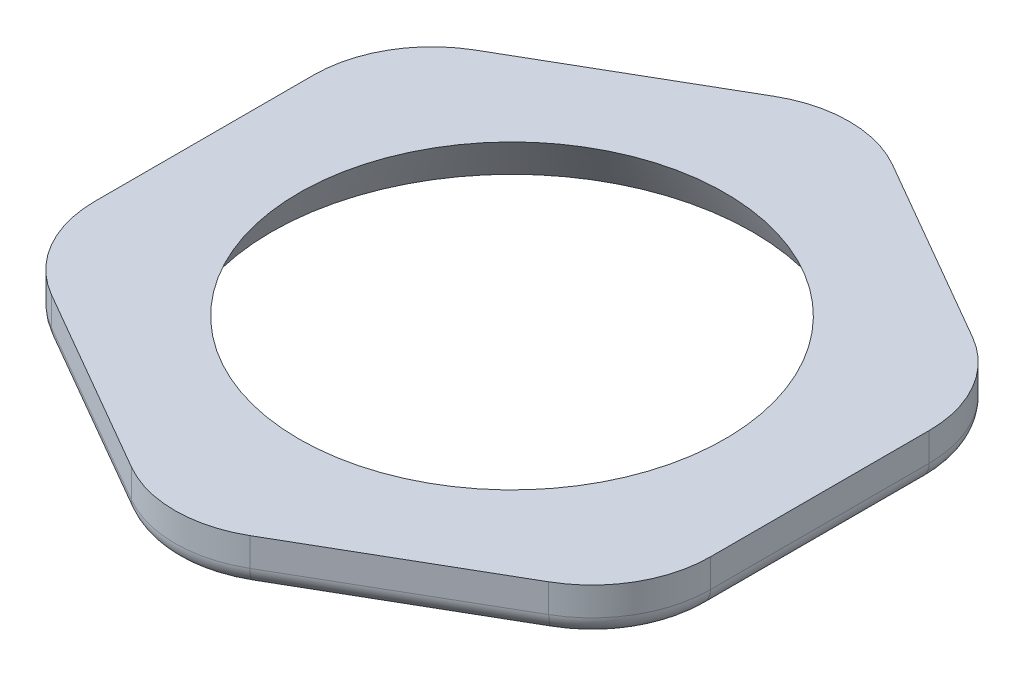
ISO-10303-21;
HEADER;
FILE_DESCRIPTION(('STEP AP214'),'2;1');
FILE_NAME('part.step','',(''),(''),'','','');
FILE_SCHEMA(('AUTOMOTIVE_DESIGN { 1 0 10303 214 1 1 1 1 }'));
ENDSEC;
DATA;
#1=APPLICATION_CONTEXT('core data for automotive mechanical design processes');
#2=APPLICATION_PROTOCOL_DEFINITION('international standard','automotive_design',2000,#1);
#3=PRODUCT_CONTEXT('',#1,'mechanical');
#4=PRODUCT('Part','Part','',(#3));
#5=PRODUCT_RELATED_PRODUCT_CATEGORY('part','',(#4));
#6=PRODUCT_DEFINITION_FORMATION('','',#4);
#7=PRODUCT_DEFINITION_CONTEXT('part definition',#1,'design');
#8=PRODUCT_DEFINITION('design','',#6,#7);
#9=PRODUCT_DEFINITION_SHAPE('','',#8);
#10=(LENGTH_UNIT() NAMED_UNIT(*) SI_UNIT(.MILLI.,.METRE.));
#11=(NAMED_UNIT(*) PLANE_ANGLE_UNIT() SI_UNIT($,.RADIAN.));
#12=(NAMED_UNIT(*) SI_UNIT($,.STERADIAN.) SOLID_ANGLE_UNIT());
#13=UNCERTAINTY_MEASURE_WITH_UNIT(LENGTH_MEASURE(1.E-05),#10,'distance_accuracy_value','');
#14=(GEOMETRIC_REPRESENTATION_CONTEXT(3) GLOBAL_UNCERTAINTY_ASSIGNED_CONTEXT((#13)) GLOBAL_UNIT_ASSIGNED_CONTEXT((#10,
#11,#12)) REPRESENTATION_CONTEXT('',''));
#15=CARTESIAN_POINT('',(0.,0.,0.));
#16=DIRECTION('',(0.,0.,1.));
#17=DIRECTION('',(1.,0.,0.));
#18=AXIS2_PLACEMENT_3D('',#15,#16,#17);
#19=CARTESIAN_POINT('',(4.,1.,-2.3094010767585));
#20=DIRECTION('',(0.,1.,0.));
#21=DIRECTION('',(0.,0.,1.));
#22=AXIS2_PLACEMENT_3D('',#19,#20,#21);
#23=PLANE('',#22);
#24=CARTESIAN_POINT('',(4.,1.,-2.3094010767585));
#25=DIRECTION('',(0.,1.,0.));
#26=DIRECTION('',(0.,0.,1.));
#27=AXIS2_PLACEMENT_3D('',#24,#25,#26);
#28=CIRCLE('',#27,2.5);
#29=CARTESIAN_POINT('',(6.5,1.,-2.3094010767585));
#30=VERTEX_POINT('',#29);
#31=CARTESIAN_POINT('',(5.25,1.,-4.4744645862196));
#32=VERTEX_POINT('',#31);
#33=EDGE_CURVE('E183',#30,#32,#28,.T.);
#34=ORIENTED_EDGE('',*,*,#33,.T.);
#35=DIRECTION('',(-0.866025403784439,0.,-0.5));
#36=VECTOR('',#35,1.);
#37=CARTESIAN_POINT('',(5.25,1.,-4.4744645862196));
#38=LINE('',#37,#36);
#39=CARTESIAN_POINT('',(1.25,1.,-6.7838656629781));
#40=VERTEX_POINT('',#39);
#41=EDGE_CURVE('E172',#32,#40,#38,.T.);
#42=ORIENTED_EDGE('',*,*,#41,.T.);
#43=CARTESIAN_POINT('',(0.,1.,-4.61880215351701));
#44=DIRECTION('',(0.,1.,0.));
#45=DIRECTION('',(0.,0.,1.));
#46=AXIS2_PLACEMENT_3D('',#43,#44,#45);
#47=CIRCLE('',#46,2.5);
#48=CARTESIAN_POINT('',(-1.25,1.,-6.7838656629781));
#49=VERTEX_POINT('',#48);
#50=EDGE_CURVE('E182',#40,#49,#47,.T.);
#51=ORIENTED_EDGE('',*,*,#50,.T.);
#52=DIRECTION('',(-0.866025403784438,0.,0.5));
#53=VECTOR('',#52,1.);
#54=CARTESIAN_POINT('',(-1.25,1.,-6.7838656629781));
#55=LINE('',#54,#53);
#56=CARTESIAN_POINT('',(-5.25,1.,-4.4744645862196));
#57=VERTEX_POINT('',#56);
#58=EDGE_CURVE('E332',#49,#57,#55,.T.);
#59=ORIENTED_EDGE('',*,*,#58,.T.);
#60=CARTESIAN_POINT('',(-4.,1.,-2.3094010767585));
#61=DIRECTION('',(0.,1.,0.));
#62=DIRECTION('',(0.,0.,1.));
#63=AXIS2_PLACEMENT_3D('',#60,#61,#62);
#64=CIRCLE('',#63,2.5);
#65=CARTESIAN_POINT('',(-6.5,1.,-2.3094010767585));
#66=VERTEX_POINT('',#65);
#67=EDGE_CURVE('E335',#57,#66,#64,.T.);
#68=ORIENTED_EDGE('',*,*,#67,.T.);
#69=DIRECTION('',(0.,0.,1.));
#70=VECTOR('',#69,1.);
#71=CARTESIAN_POINT('',(-6.5,1.,-2.3094010767585));
#72=LINE('',#71,#70);
#73=CARTESIAN_POINT('',(-6.5,1.,2.3094010767585));
#74=VERTEX_POINT('',#73);
#75=EDGE_CURVE('E338',#66,#74,#72,.T.);
#76=ORIENTED_EDGE('',*,*,#75,.T.);
#77=CARTESIAN_POINT('',(-4.,1.,2.3094010767585));
#78=DIRECTION('',(0.,1.,0.));
#79=DIRECTION('',(0.,0.,1.));
#80=AXIS2_PLACEMENT_3D('',#77,#78,#79);
#81=CIRCLE('',#80,2.5);
#82=CARTESIAN_POINT('',(-5.25,1.,4.4744645862196));
#83=VERTEX_POINT('',#82);
#84=EDGE_CURVE('E341',#74,#83,#81,.T.);
#85=ORIENTED_EDGE('',*,*,#84,.T.);
#86=DIRECTION('',(0.866025403784439,0.,0.5));
#87=VECTOR('',#86,1.);
#88=CARTESIAN_POINT('',(-5.25,1.,4.4744645862196));
#89=LINE('',#88,#87);
#90=CARTESIAN_POINT('',(-1.25,1.,6.7838656629781));
#91=VERTEX_POINT('',#90);
#92=EDGE_CURVE('E344',#83,#91,#89,.T.);
#93=ORIENTED_EDGE('',*,*,#92,.T.);
#94=CARTESIAN_POINT('',(0.,1.,4.618802153517));
#95=DIRECTION('',(0.,1.,0.));
#96=DIRECTION('',(0.,0.,-1.));
#97=AXIS2_PLACEMENT_3D('',#94,#95,#96);
#98=CIRCLE('',#97,2.5);
#99=CARTESIAN_POINT('',(1.25,1.,6.7838656629781));
#100=VERTEX_POINT('',#99);
#101=EDGE_CURVE('E347',#91,#100,#98,.T.);
#102=ORIENTED_EDGE('',*,*,#101,.T.);
#103=DIRECTION('',(0.866025403784438,0.,-0.5));
#104=VECTOR('',#103,1.);
#105=CARTESIAN_POINT('',(1.25,1.,6.7838656629781));
#106=LINE('',#105,#104);
#107=CARTESIAN_POINT('',(5.25,1.,4.47446458621959));
#108=VERTEX_POINT('',#107);
#109=EDGE_CURVE('E350',#100,#108,#106,.T.);
#110=ORIENTED_EDGE('',*,*,#109,.T.);
#111=CARTESIAN_POINT('',(4.,1.,2.3094010767585));
#112=DIRECTION('',(0.,1.,0.));
#113=DIRECTION('',(0.,0.,-1.));
#114=AXIS2_PLACEMENT_3D('',#111,#112,#113);
#115=CIRCLE('',#114,2.5);
#116=CARTESIAN_POINT('',(6.5,1.,2.3094010767585));
#117=VERTEX_POINT('',#116);
#118=EDGE_CURVE('E353',#108,#117,#115,.T.);
#119=ORIENTED_EDGE('',*,*,#118,.T.);
#120=DIRECTION('',(0.,0.,-1.));
#121=VECTOR('',#120,1.);
#122=CARTESIAN_POINT('',(6.5,1.,2.3094010767585));
#123=LINE('',#122,#121);
#124=EDGE_CURVE('E188',#117,#30,#123,.T.);
#125=ORIENTED_EDGE('',*,*,#124,.T.);
#126=EDGE_LOOP('',(#34,#42,#51,#59,#68,#76,#85,#93,#102,#110,#119,#125));
#127=FACE_BOUND('',#126,.T.);
#128=CARTESIAN_POINT('',(0.,1.,0.));
#129=DIRECTION('',(0.,1.,0.));
#130=DIRECTION('',(0.,0.,1.));
#131=AXIS2_PLACEMENT_3D('',#128,#129,#130);
#132=CIRCLE('',#131,4.5);
#133=CARTESIAN_POINT('',(0.,1.,4.5));
#134=VERTEX_POINT('',#133);
#135=EDGE_CURVE('E316',#134,#134,#132,.T.);
#136=ORIENTED_EDGE('',*,*,#135,.F.);
#137=EDGE_LOOP('',(#136));
#138=FACE_BOUND('',#137,.T.);
#139=ADVANCED_FACE('F45',(#127,#138),#23,.T.);
#140=CARTESIAN_POINT('',(4.,0.,-2.3094010767585));
#141=DIRECTION('',(0.,1.,0.));
#142=DIRECTION('',(0.,0.,1.));
#143=AXIS2_PLACEMENT_3D('',#140,#141,#142);
#144=PLANE('',#143);
#145=DIRECTION('',(0.,0.,-1.));
#146=VECTOR('',#145,1.);
#147=CARTESIAN_POINT('',(6.1,0.,-2.3094010767585));
#148=LINE('',#147,#146);
#149=CARTESIAN_POINT('',(6.1,0.,-2.3094010767585));
#150=VERTEX_POINT('',#149);
#151=CARTESIAN_POINT('',(6.1,0.,2.3094010767585));
#152=VERTEX_POINT('',#151);
#153=EDGE_CURVE('E199',#150,#152,#148,.F.);
#154=ORIENTED_EDGE('',*,*,#153,.T.);
#155=CARTESIAN_POINT('',(4.,0.,2.3094010767585));
#156=DIRECTION('',(0.,1.,0.));
#157=DIRECTION('',(0.,0.,1.));
#158=AXIS2_PLACEMENT_3D('',#155,#156,#157);
#159=CIRCLE('',#158,2.1);
#160=CARTESIAN_POINT('',(5.05,0.,4.12805442470582));
#161=VERTEX_POINT('',#160);
#162=EDGE_CURVE('E237',#152,#161,#159,.F.);
#163=ORIENTED_EDGE('',*,*,#162,.T.);
#164=DIRECTION('',(0.866025403784439,0.,-0.5));
#165=VECTOR('',#164,1.);
#166=CARTESIAN_POINT('',(7.05,0.,2.97335388632657));
#167=LINE('',#166,#165);
#168=CARTESIAN_POINT('',(1.05,0.,6.43745550146432));
#169=VERTEX_POINT('',#168);
#170=EDGE_CURVE('E234',#161,#169,#167,.F.);
#171=ORIENTED_EDGE('',*,*,#170,.T.);
#172=CARTESIAN_POINT('',(0.,0.,4.618802153517));
#173=DIRECTION('',(0.,1.,0.));
#174=DIRECTION('',(0.,0.,1.));
#175=AXIS2_PLACEMENT_3D('',#172,#173,#174);
#176=CIRCLE('',#175,2.1);
#177=CARTESIAN_POINT('',(-1.05,0.,6.43745550146432));
#178=VERTEX_POINT('',#177);
#179=EDGE_CURVE('E231',#169,#178,#176,.F.);
#180=ORIENTED_EDGE('',*,*,#179,.T.);
#181=DIRECTION('',(0.866025403784439,0.,0.5));
#182=VECTOR('',#181,1.);
#183=CARTESIAN_POINT('',(-1.05,0.,6.43745550146433));
#184=LINE('',#183,#182);
#185=CARTESIAN_POINT('',(-5.05,0.,4.12805442470582));
#186=VERTEX_POINT('',#185);
#187=EDGE_CURVE('E228',#178,#186,#184,.F.);
#188=ORIENTED_EDGE('',*,*,#187,.T.);
#189=CARTESIAN_POINT('',(-4.,0.,2.3094010767585));
#190=DIRECTION('',(0.,1.,0.));
#191=DIRECTION('',(0.,0.,1.));
#192=AXIS2_PLACEMENT_3D('',#189,#190,#191);
#193=CIRCLE('',#192,2.1);
#194=CARTESIAN_POINT('',(-6.1,0.,2.3094010767585));
#195=VERTEX_POINT('',#194);
#196=EDGE_CURVE('E225',#186,#195,#193,.F.);
#197=ORIENTED_EDGE('',*,*,#196,.T.);
#198=DIRECTION('',(0.,0.,1.));
#199=VECTOR('',#198,1.);
#200=CARTESIAN_POINT('',(-6.1,0.,-2.3094010767585));
#201=LINE('',#200,#199);
#202=CARTESIAN_POINT('',(-6.1,0.,-2.3094010767585));
#203=VERTEX_POINT('',#202);
#204=EDGE_CURVE('E222',#195,#203,#201,.F.);
#205=ORIENTED_EDGE('',*,*,#204,.T.);
#206=CARTESIAN_POINT('',(-4.,0.,-2.3094010767585));
#207=DIRECTION('',(0.,1.,0.));
#208=DIRECTION('',(0.,0.,1.));
#209=AXIS2_PLACEMENT_3D('',#206,#207,#208);
#210=CIRCLE('',#209,2.1);
#211=CARTESIAN_POINT('',(-5.05,0.,-4.12805442470582));
#212=VERTEX_POINT('',#211);
#213=EDGE_CURVE('E219',#203,#212,#210,.F.);
#214=ORIENTED_EDGE('',*,*,#213,.T.);
#215=DIRECTION('',(-0.866025403784438,0.,0.5));
#216=VECTOR('',#215,1.);
#217=CARTESIAN_POINT('',(0.949999999999999,0.,-7.59215603984358));
#218=LINE('',#217,#216);
#219=CARTESIAN_POINT('',(-1.05,0.,-6.43745550146433));
#220=VERTEX_POINT('',#219);
#221=EDGE_CURVE('E216',#212,#220,#218,.F.);
#222=ORIENTED_EDGE('',*,*,#221,.T.);
#223=CARTESIAN_POINT('',(0.,0.,-4.61880215351701));
#224=DIRECTION('',(0.,1.,0.));
#225=DIRECTION('',(0.,0.,1.));
#226=AXIS2_PLACEMENT_3D('',#223,#224,#225);
#227=CIRCLE('',#226,2.1);
#228=CARTESIAN_POINT('',(1.05,0.,-6.43745550146433));
#229=VERTEX_POINT('',#228);
#230=EDGE_CURVE('E213',#220,#229,#227,.F.);
#231=ORIENTED_EDGE('',*,*,#230,.T.);
#232=DIRECTION('',(-0.866025403784439,0.,-0.5));
#233=VECTOR('',#232,1.);
#234=CARTESIAN_POINT('',(5.05,0.,-4.12805442470582));
#235=LINE('',#234,#233);
#236=CARTESIAN_POINT('',(5.05,0.,-4.12805442470582));
#237=VERTEX_POINT('',#236);
#238=EDGE_CURVE('E210',#229,#237,#235,.F.);
#239=ORIENTED_EDGE('',*,*,#238,.T.);
#240=CARTESIAN_POINT('',(4.,0.,-2.3094010767585));
#241=DIRECTION('',(0.,1.,0.));
#242=DIRECTION('',(0.,0.,1.));
#243=AXIS2_PLACEMENT_3D('',#240,#241,#242);
#244=CIRCLE('',#243,2.1);
#245=EDGE_CURVE('E207',#237,#150,#244,.F.);
#246=ORIENTED_EDGE('',*,*,#245,.T.);
#247=EDGE_LOOP('',(#154,#163,#171,#180,#188,#197,#205,#214,#222,#231,#239,#246));
#248=FACE_BOUND('',#247,.T.);
#249=CARTESIAN_POINT('',(0.,0.,0.));
#250=DIRECTION('',(0.,1.,0.));
#251=DIRECTION('',(0.,0.,1.));
#252=AXIS2_PLACEMENT_3D('',#249,#250,#251);
#253=CIRCLE('',#252,5.07735026918963);
#254=CARTESIAN_POINT('',(0.,0.,5.07735026918963));
#255=VERTEX_POINT('',#254);
#256=EDGE_CURVE('E190',#255,#255,#253,.T.);
#257=ORIENTED_EDGE('',*,*,#256,.T.);
#258=EDGE_LOOP('',(#257));
#259=FACE_BOUND('',#258,.T.);
#260=ADVANCED_FACE('F408',(#248,#259),#144,.F.);
#261=CARTESIAN_POINT('',(4.,1.,-2.3094010767585));
#262=DIRECTION('',(0.,-1.,0.));
#263=DIRECTION('',(0.,0.,-1.));
#264=AXIS2_PLACEMENT_3D('',#261,#262,#263);
#265=CYLINDRICAL_SURFACE('',#264,2.5);
#266=DIRECTION('',(0.,-1.,0.));
#267=VECTOR('',#266,1.);
#268=CARTESIAN_POINT('',(6.5,1.,-2.3094010767585));
#269=LINE('',#268,#267);
#270=CARTESIAN_POINT('',(6.5,0.4,-2.3094010767585));
#271=VERTEX_POINT('',#270);
#272=EDGE_CURVE('E358',#30,#271,#269,.T.);
#273=ORIENTED_EDGE('',*,*,#272,.T.);
#274=CARTESIAN_POINT('',(4.,0.4,-2.3094010767585));
#275=DIRECTION('',(0.,1.,0.));
#276=DIRECTION('',(0.,0.,1.));
#277=AXIS2_PLACEMENT_3D('',#274,#275,#276);
#278=CIRCLE('',#277,2.5);
#279=CARTESIAN_POINT('',(5.25,0.4,-4.4744645862196));
#280=VERTEX_POINT('',#279);
#281=EDGE_CURVE('E55',#271,#280,#278,.T.);
#282=ORIENTED_EDGE('',*,*,#281,.T.);
#283=DIRECTION('',(0.,-1.,0.));
#284=VECTOR('',#283,1.);
#285=CARTESIAN_POINT('',(5.25,1.,-4.4744645862196));
#286=LINE('',#285,#284);
#287=EDGE_CURVE('E175',#32,#280,#286,.T.);
#288=ORIENTED_EDGE('',*,*,#287,.F.);
#289=ORIENTED_EDGE('',*,*,#33,.F.);
#290=EDGE_LOOP('',(#273,#282,#288,#289));
#291=FACE_BOUND('',#290,.T.);
#292=ADVANCED_FACE('F192',(#291),#265,.T.);
#293=CARTESIAN_POINT('',(5.25,1.,-4.4744645862196));
#294=DIRECTION('',(-0.5,0.,0.866025403784439));
#295=DIRECTION('',(0.866025403784439,0.,0.5));
#296=AXIS2_PLACEMENT_3D('',#293,#294,#295);
#297=PLANE('',#296);
#298=ORIENTED_EDGE('',*,*,#287,.T.);
#299=DIRECTION('',(-0.866025403784439,0.,-0.5));
#300=VECTOR('',#299,1.);
#301=CARTESIAN_POINT('',(5.25,0.4,-4.4744645862196));
#302=LINE('',#301,#300);
#303=CARTESIAN_POINT('',(1.25,0.4,-6.7838656629781));
#304=VERTEX_POINT('',#303);
#305=EDGE_CURVE('E265',#280,#304,#302,.T.);
#306=ORIENTED_EDGE('',*,*,#305,.T.);
#307=DIRECTION('',(0.,-1.,0.));
#308=VECTOR('',#307,1.);
#309=CARTESIAN_POINT('',(1.25,1.,-6.7838656629781));
#310=LINE('',#309,#308);
#311=EDGE_CURVE('E178',#40,#304,#310,.T.);
#312=ORIENTED_EDGE('',*,*,#311,.F.);
#313=ORIENTED_EDGE('',*,*,#41,.F.);
#314=EDGE_LOOP('',(#298,#306,#312,#313));
#315=FACE_BOUND('',#314,.T.);
#316=ADVANCED_FACE('F174',(#315),#297,.F.);
#317=CARTESIAN_POINT('',(0.,1.,-4.61880215351701));
#318=DIRECTION('',(0.,-1.,0.));
#319=DIRECTION('',(0.,0.,-1.));
#320=AXIS2_PLACEMENT_3D('',#317,#318,#319);
#321=CYLINDRICAL_SURFACE('',#320,2.5);
#322=ORIENTED_EDGE('',*,*,#311,.T.);
#323=CARTESIAN_POINT('',(0.,0.4,-4.61880215351701));
#324=DIRECTION('',(0.,1.,0.));
#325=DIRECTION('',(0.,0.,1.));
#326=AXIS2_PLACEMENT_3D('',#323,#324,#325);
#327=CIRCLE('',#326,2.5);
#328=CARTESIAN_POINT('',(-1.25,0.4,-6.7838656629781));
#329=VERTEX_POINT('',#328);
#330=EDGE_CURVE('E262',#304,#329,#327,.T.);
#331=ORIENTED_EDGE('',*,*,#330,.T.);
#332=DIRECTION('',(0.,-1.,0.));
#333=VECTOR('',#332,1.);
#334=CARTESIAN_POINT('',(-1.25,1.,-6.7838656629781));
#335=LINE('',#334,#333);
#336=EDGE_CURVE('E201',#49,#329,#335,.T.);
#337=ORIENTED_EDGE('',*,*,#336,.F.);
#338=ORIENTED_EDGE('',*,*,#50,.F.);
#339=EDGE_LOOP('',(#322,#331,#337,#338));
#340=FACE_BOUND('',#339,.T.);
#341=ADVANCED_FACE('F424',(#340),#321,.T.);
#342=CARTESIAN_POINT('',(-1.25,1.,-6.7838656629781));
#343=DIRECTION('',(0.5,0.,0.866025403784439));
#344=DIRECTION('',(0.866025403784438,0.,-0.5));
#345=AXIS2_PLACEMENT_3D('',#342,#343,#344);
#346=PLANE('',#345);
#347=ORIENTED_EDGE('',*,*,#336,.T.);
#348=DIRECTION('',(-0.866025403784438,0.,0.5));
#349=VECTOR('',#348,1.);
#350=CARTESIAN_POINT('',(-1.25,0.4,-6.7838656629781));
#351=LINE('',#350,#349);
#352=CARTESIAN_POINT('',(-5.25,0.4,-4.4744645862196));
#353=VERTEX_POINT('',#352);
#354=EDGE_CURVE('E259',#329,#353,#351,.T.);
#355=ORIENTED_EDGE('',*,*,#354,.T.);
#356=DIRECTION('',(0.,-1.,0.));
#357=VECTOR('',#356,1.);
#358=CARTESIAN_POINT('',(-5.25,1.,-4.4744645862196));
#359=LINE('',#358,#357);
#360=EDGE_CURVE('E388',#57,#353,#359,.T.);
#361=ORIENTED_EDGE('',*,*,#360,.F.);
#362=ORIENTED_EDGE('',*,*,#58,.F.);
#363=EDGE_LOOP('',(#347,#355,#361,#362));
#364=FACE_BOUND('',#363,.T.);
#365=ADVANCED_FACE('F396',(#364),#346,.F.);
#366=CARTESIAN_POINT('',(-4.,1.,-2.3094010767585));
#367=DIRECTION('',(0.,-1.,0.));
#368=DIRECTION('',(0.,0.,-1.));
#369=AXIS2_PLACEMENT_3D('',#366,#367,#368);
#370=CYLINDRICAL_SURFACE('',#369,2.5);
#371=ORIENTED_EDGE('',*,*,#360,.T.);
#372=CARTESIAN_POINT('',(-4.,0.4,-2.3094010767585));
#373=DIRECTION('',(0.,1.,0.));
#374=DIRECTION('',(0.,0.,1.));
#375=AXIS2_PLACEMENT_3D('',#372,#373,#374);
#376=CIRCLE('',#375,2.5);
#377=CARTESIAN_POINT('',(-6.5,0.4,-2.3094010767585));
#378=VERTEX_POINT('',#377);
#379=EDGE_CURVE('E256',#353,#378,#376,.T.);
#380=ORIENTED_EDGE('',*,*,#379,.T.);
#381=DIRECTION('',(0.,-1.,0.));
#382=VECTOR('',#381,1.);
#383=CARTESIAN_POINT('',(-6.5,1.,-2.3094010767585));
#384=LINE('',#383,#382);
#385=EDGE_CURVE('E384',#66,#378,#384,.T.);
#386=ORIENTED_EDGE('',*,*,#385,.F.);
#387=ORIENTED_EDGE('',*,*,#67,.F.);
#388=EDGE_LOOP('',(#371,#380,#386,#387));
#389=FACE_BOUND('',#388,.T.);
#390=ADVANCED_FACE('F416',(#389),#370,.T.);
#391=CARTESIAN_POINT('',(-6.5,1.,-2.3094010767585));
#392=DIRECTION('',(1.,0.,0.));
#393=DIRECTION('',(0.,0.,-1.));
#394=AXIS2_PLACEMENT_3D('',#391,#392,#393);
#395=PLANE('',#394);
#396=ORIENTED_EDGE('',*,*,#385,.T.);
#397=DIRECTION('',(0.,0.,1.));
#398=VECTOR('',#397,1.);
#399=CARTESIAN_POINT('',(-6.5,0.4,-2.3094010767585));
#400=LINE('',#399,#398);
#401=CARTESIAN_POINT('',(-6.5,0.4,2.3094010767585));
#402=VERTEX_POINT('',#401);
#403=EDGE_CURVE('E253',#378,#402,#400,.T.);
#404=ORIENTED_EDGE('',*,*,#403,.T.);
#405=DIRECTION('',(0.,-1.,0.));
#406=VECTOR('',#405,1.);
#407=CARTESIAN_POINT('',(-6.5,1.,2.3094010767585));
#408=LINE('',#407,#406);
#409=EDGE_CURVE('E380',#74,#402,#408,.T.);
#410=ORIENTED_EDGE('',*,*,#409,.F.);
#411=ORIENTED_EDGE('',*,*,#75,.F.);
#412=EDGE_LOOP('',(#396,#404,#410,#411));
#413=FACE_BOUND('',#412,.T.);
#414=ADVANCED_FACE('F420',(#413),#395,.F.);
#415=CARTESIAN_POINT('',(-4.,1.,2.3094010767585));
#416=DIRECTION('',(0.,-1.,0.));
#417=DIRECTION('',(0.,0.,-1.));
#418=AXIS2_PLACEMENT_3D('',#415,#416,#417);
#419=CYLINDRICAL_SURFACE('',#418,2.5);
#420=ORIENTED_EDGE('',*,*,#409,.T.);
#421=CARTESIAN_POINT('',(-4.,0.4,2.3094010767585));
#422=DIRECTION('',(0.,1.,0.));
#423=DIRECTION('',(0.,0.,1.));
#424=AXIS2_PLACEMENT_3D('',#421,#422,#423);
#425=CIRCLE('',#424,2.5);
#426=CARTESIAN_POINT('',(-5.25,0.4,4.4744645862196));
#427=VERTEX_POINT('',#426);
#428=EDGE_CURVE('E250',#402,#427,#425,.T.);
#429=ORIENTED_EDGE('',*,*,#428,.T.);
#430=DIRECTION('',(0.,-1.,0.));
#431=VECTOR('',#430,1.);
#432=CARTESIAN_POINT('',(-5.25,1.,4.4744645862196));
#433=LINE('',#432,#431);
#434=EDGE_CURVE('E376',#83,#427,#433,.T.);
#435=ORIENTED_EDGE('',*,*,#434,.F.);
#436=ORIENTED_EDGE('',*,*,#84,.F.);
#437=EDGE_LOOP('',(#420,#429,#435,#436));
#438=FACE_BOUND('',#437,.T.);
#439=ADVANCED_FACE('F461',(#438),#419,.T.);
#440=CARTESIAN_POINT('',(-5.25,1.,4.4744645862196));
#441=DIRECTION('',(0.5,0.,-0.866025403784439));
#442=DIRECTION('',(-0.866025403784439,0.,-0.5));
#443=AXIS2_PLACEMENT_3D('',#440,#441,#442);
#444=PLANE('',#443);
#445=ORIENTED_EDGE('',*,*,#434,.T.);
#446=DIRECTION('',(0.866025403784439,0.,0.5));
#447=VECTOR('',#446,1.);
#448=CARTESIAN_POINT('',(-5.25,0.4,4.4744645862196));
#449=LINE('',#448,#447);
#450=CARTESIAN_POINT('',(-1.25,0.4,6.7838656629781));
#451=VERTEX_POINT('',#450);
#452=EDGE_CURVE('E247',#427,#451,#449,.T.);
#453=ORIENTED_EDGE('',*,*,#452,.T.);
#454=DIRECTION('',(0.,-1.,0.));
#455=VECTOR('',#454,1.);
#456=CARTESIAN_POINT('',(-1.25,1.,6.7838656629781));
#457=LINE('',#456,#455);
#458=EDGE_CURVE('E372',#91,#451,#457,.T.);
#459=ORIENTED_EDGE('',*,*,#458,.F.);
#460=ORIENTED_EDGE('',*,*,#92,.F.);
#461=EDGE_LOOP('',(#445,#453,#459,#460));
#462=FACE_BOUND('',#461,.T.);
#463=ADVANCED_FACE('F457',(#462),#444,.F.);
#464=CARTESIAN_POINT('',(0.,1.,4.618802153517));
#465=DIRECTION('',(0.,-1.,0.));
#466=DIRECTION('',(0.,0.,-1.));
#467=AXIS2_PLACEMENT_3D('',#464,#465,#466);
#468=CYLINDRICAL_SURFACE('',#467,2.5);
#469=ORIENTED_EDGE('',*,*,#458,.T.);
#470=CARTESIAN_POINT('',(0.,0.4,4.618802153517));
#471=DIRECTION('',(0.,1.,0.));
#472=DIRECTION('',(0.,0.,1.));
#473=AXIS2_PLACEMENT_3D('',#470,#471,#472);
#474=CIRCLE('',#473,2.5);
#475=CARTESIAN_POINT('',(1.25,0.4,6.7838656629781));
#476=VERTEX_POINT('',#475);
#477=EDGE_CURVE('E244',#451,#476,#474,.T.);
#478=ORIENTED_EDGE('',*,*,#477,.T.);
#479=DIRECTION('',(0.,-1.,0.));
#480=VECTOR('',#479,1.);
#481=CARTESIAN_POINT('',(1.25,1.,6.7838656629781));
#482=LINE('',#481,#480);
#483=EDGE_CURVE('E368',#100,#476,#482,.T.);
#484=ORIENTED_EDGE('',*,*,#483,.F.);
#485=ORIENTED_EDGE('',*,*,#101,.F.);
#486=EDGE_LOOP('',(#469,#478,#484,#485));
#487=FACE_BOUND('',#486,.T.);
#488=ADVANCED_FACE('F453',(#487),#468,.T.);
#489=CARTESIAN_POINT('',(1.25,1.,6.7838656629781));
#490=DIRECTION('',(-0.5,0.,-0.866025403784438));
#491=DIRECTION('',(-0.866025403784439,0.,0.5));
#492=AXIS2_PLACEMENT_3D('',#489,#490,#491);
#493=PLANE('',#492);
#494=ORIENTED_EDGE('',*,*,#483,.T.);
#495=DIRECTION('',(0.866025403784439,0.,-0.5));
#496=VECTOR('',#495,1.);
#497=CARTESIAN_POINT('',(1.25,0.4,6.7838656629781));
#498=LINE('',#497,#496);
#499=CARTESIAN_POINT('',(5.25,0.4,4.47446458621959));
#500=VERTEX_POINT('',#499);
#501=EDGE_CURVE('E241',#476,#500,#498,.T.);
#502=ORIENTED_EDGE('',*,*,#501,.T.);
#503=DIRECTION('',(0.,-1.,0.));
#504=VECTOR('',#503,1.);
#505=CARTESIAN_POINT('',(5.25,1.,4.47446458621959));
#506=LINE('',#505,#504);
#507=EDGE_CURVE('E364',#108,#500,#506,.T.);
#508=ORIENTED_EDGE('',*,*,#507,.F.);
#509=ORIENTED_EDGE('',*,*,#109,.F.);
#510=EDGE_LOOP('',(#494,#502,#508,#509));
#511=FACE_BOUND('',#510,.T.);
#512=ADVANCED_FACE('F449',(#511),#493,.F.);
#513=CARTESIAN_POINT('',(4.,1.,2.3094010767585));
#514=DIRECTION('',(0.,-1.,0.));
#515=DIRECTION('',(0.,0.,-1.));
#516=AXIS2_PLACEMENT_3D('',#513,#514,#515);
#517=CYLINDRICAL_SURFACE('',#516,2.5);
#518=ORIENTED_EDGE('',*,*,#507,.T.);
#519=CARTESIAN_POINT('',(4.,0.4,2.3094010767585));
#520=DIRECTION('',(0.,1.,0.));
#521=DIRECTION('',(0.,0.,1.));
#522=AXIS2_PLACEMENT_3D('',#519,#520,#521);
#523=CIRCLE('',#522,2.5);
#524=CARTESIAN_POINT('',(6.5,0.4,2.3094010767585));
#525=VERTEX_POINT('',#524);
#526=EDGE_CURVE('E194',#500,#525,#523,.T.);
#527=ORIENTED_EDGE('',*,*,#526,.T.);
#528=DIRECTION('',(0.,-1.,0.));
#529=VECTOR('',#528,1.);
#530=CARTESIAN_POINT('',(6.5,1.,2.3094010767585));
#531=LINE('',#530,#529);
#532=EDGE_CURVE('E361',#117,#525,#531,.T.);
#533=ORIENTED_EDGE('',*,*,#532,.F.);
#534=ORIENTED_EDGE('',*,*,#118,.F.);
#535=EDGE_LOOP('',(#518,#527,#533,#534));
#536=FACE_BOUND('',#535,.T.);
#537=ADVANCED_FACE('F446',(#536),#517,.T.);
#538=CARTESIAN_POINT('',(6.5,1.,2.3094010767585));
#539=DIRECTION('',(-1.,0.,0.));
#540=DIRECTION('',(0.,0.,1.));
#541=AXIS2_PLACEMENT_3D('',#538,#539,#540);
#542=PLANE('',#541);
#543=ORIENTED_EDGE('',*,*,#532,.T.);
#544=DIRECTION('',(0.,0.,-1.));
#545=VECTOR('',#544,1.);
#546=CARTESIAN_POINT('',(6.5,0.4,2.3094010767585));
#547=LINE('',#546,#545);
#548=EDGE_CURVE('E11',#525,#271,#547,.T.);
#549=ORIENTED_EDGE('',*,*,#548,.T.);
#550=ORIENTED_EDGE('',*,*,#272,.F.);
#551=ORIENTED_EDGE('',*,*,#124,.F.);
#552=EDGE_LOOP('',(#543,#549,#550,#551));
#553=FACE_BOUND('',#552,.T.);
#554=ADVANCED_FACE('F443',(#553),#542,.F.);
#555=CARTESIAN_POINT('',(0.,1.,0.));
#556=DIRECTION('',(0.,-1.,0.));
#557=DIRECTION('',(0.,0.,1.));
#558=AXIS2_PLACEMENT_3D('',#555,#556,#557);
#559=CONICAL_SURFACE('',#558,4.5,0.5235987755983);
#560=ORIENTED_EDGE('',*,*,#256,.F.);
#561=EDGE_LOOP('',(#560));
#562=FACE_BOUND('',#561,.T.);
#563=ORIENTED_EDGE('',*,*,#135,.T.);
#564=EDGE_LOOP('',(#563));
#565=FACE_BOUND('',#564,.T.);
#566=ADVANCED_FACE('F441',(#562,#565),#559,.F.);
#567=CARTESIAN_POINT('',(-4.,0.4,-2.3094010767585));
#568=DIRECTION('',(0.,1.,0.));
#569=DIRECTION('',(0.,0.,1.));
#570=AXIS2_PLACEMENT_3D('',#567,#568,#569);
#571=TOROIDAL_SURFACE('',#570,2.1,0.4);
#572=CARTESIAN_POINT('',(-5.05,0.4,-4.12805442470582));
#573=DIRECTION('',(0.866025403784439,0.,-0.499999999999999));
#574=DIRECTION('',(-0.499999999999999,0.,-0.866025403784439));
#575=AXIS2_PLACEMENT_3D('',#572,#573,#574);
#576=CIRCLE('',#575,0.4);
#577=EDGE_CURVE('E307',#212,#353,#576,.T.);
#578=ORIENTED_EDGE('',*,*,#577,.F.);
#579=ORIENTED_EDGE('',*,*,#213,.F.);
#580=CARTESIAN_POINT('',(-6.1,0.4,-2.3094010767585));
#581=DIRECTION('',(0.,0.,1.));
#582=DIRECTION('',(1.,0.,0.));
#583=AXIS2_PLACEMENT_3D('',#580,#581,#582);
#584=CIRCLE('',#583,0.4);
#585=EDGE_CURVE('E49',#378,#203,#584,.T.);
#586=ORIENTED_EDGE('',*,*,#585,.F.);
#587=ORIENTED_EDGE('',*,*,#379,.F.);
#588=EDGE_LOOP('',(#578,#579,#586,#587));
#589=FACE_BOUND('',#588,.T.);
#590=ADVANCED_FACE('F47',(#589),#571,.T.);
#591=CARTESIAN_POINT('',(-6.1,0.4,-2.3094010767585));
#592=DIRECTION('',(0.,0.,1.));
#593=DIRECTION('',(1.,0.,0.));
#594=AXIS2_PLACEMENT_3D('',#591,#592,#593);
#595=CYLINDRICAL_SURFACE('',#594,0.4);
#596=ORIENTED_EDGE('',*,*,#585,.T.);
#597=ORIENTED_EDGE('',*,*,#204,.F.);
#598=CARTESIAN_POINT('',(-6.1,0.4,2.3094010767585));
#599=DIRECTION('',(0.,0.,1.));
#600=DIRECTION('',(1.,0.,0.));
#601=AXIS2_PLACEMENT_3D('',#598,#599,#600);
#602=CIRCLE('',#601,0.4);
#603=EDGE_CURVE('E304',#402,#195,#602,.T.);
#604=ORIENTED_EDGE('',*,*,#603,.F.);
#605=ORIENTED_EDGE('',*,*,#403,.F.);
#606=EDGE_LOOP('',(#596,#597,#604,#605));
#607=FACE_BOUND('',#606,.T.);
#608=ADVANCED_FACE('F516',(#607),#595,.T.);
#609=CARTESIAN_POINT('',(-1.05,0.4,-6.43745550146433));
#610=DIRECTION('',(-0.866025403784438,0.,0.5));
#611=DIRECTION('',(0.5,0.,0.866025403784439));
#612=AXIS2_PLACEMENT_3D('',#609,#610,#611);
#613=CYLINDRICAL_SURFACE('',#612,0.4);
#614=ORIENTED_EDGE('',*,*,#577,.T.);
#615=ORIENTED_EDGE('',*,*,#354,.F.);
#616=CARTESIAN_POINT('',(-1.05,0.4,-6.43745550146433));
#617=DIRECTION('',(0.866025403784439,0.,-0.5));
#618=DIRECTION('',(-0.5,0.,-0.866025403784439));
#619=AXIS2_PLACEMENT_3D('',#616,#617,#618);
#620=CIRCLE('',#619,0.4);
#621=EDGE_CURVE('E300',#220,#329,#620,.T.);
#622=ORIENTED_EDGE('',*,*,#621,.F.);
#623=ORIENTED_EDGE('',*,*,#221,.F.);
#624=EDGE_LOOP('',(#614,#615,#622,#623));
#625=FACE_BOUND('',#624,.T.);
#626=ADVANCED_FACE('F400',(#625),#613,.T.);
#627=CARTESIAN_POINT('',(-4.,0.4,2.3094010767585));
#628=DIRECTION('',(0.,1.,0.));
#629=DIRECTION('',(0.,0.,1.));
#630=AXIS2_PLACEMENT_3D('',#627,#628,#629);
#631=TOROIDAL_SURFACE('',#630,2.1,0.4);
#632=ORIENTED_EDGE('',*,*,#603,.T.);
#633=ORIENTED_EDGE('',*,*,#196,.F.);
#634=CARTESIAN_POINT('',(-5.05,0.4,4.12805442470582));
#635=DIRECTION('',(0.866025403784439,0.,0.499999999999999));
#636=DIRECTION('',(0.499999999999999,0.,-0.866025403784439));
#637=AXIS2_PLACEMENT_3D('',#634,#635,#636);
#638=CIRCLE('',#637,0.4);
#639=EDGE_CURVE('E296',#427,#186,#638,.T.);
#640=ORIENTED_EDGE('',*,*,#639,.F.);
#641=ORIENTED_EDGE('',*,*,#428,.F.);
#642=EDGE_LOOP('',(#632,#633,#640,#641));
#643=FACE_BOUND('',#642,.T.);
#644=ADVANCED_FACE('F529',(#643),#631,.T.);
#645=CARTESIAN_POINT('',(0.,0.4,-4.61880215351701));
#646=DIRECTION('',(0.,1.,0.));
#647=DIRECTION('',(0.,0.,1.));
#648=AXIS2_PLACEMENT_3D('',#645,#646,#647);
#649=TOROIDAL_SURFACE('',#648,2.1,0.4);
#650=ORIENTED_EDGE('',*,*,#621,.T.);
#651=ORIENTED_EDGE('',*,*,#330,.F.);
#652=CARTESIAN_POINT('',(1.05,0.4,-6.43745550146433));
#653=DIRECTION('',(0.866025403784439,0.,0.5));
#654=DIRECTION('',(0.5,0.,-0.866025403784439));
#655=AXIS2_PLACEMENT_3D('',#652,#653,#654);
#656=CIRCLE('',#655,0.4);
#657=EDGE_CURVE('E292',#229,#304,#656,.T.);
#658=ORIENTED_EDGE('',*,*,#657,.F.);
#659=ORIENTED_EDGE('',*,*,#230,.F.);
#660=EDGE_LOOP('',(#650,#651,#658,#659));
#661=FACE_BOUND('',#660,.T.);
#662=ADVANCED_FACE('F404',(#661),#649,.T.);
#663=CARTESIAN_POINT('',(-5.05,0.4,4.12805442470582));
#664=DIRECTION('',(0.866025403784439,0.,0.5));
#665=DIRECTION('',(0.5,0.,-0.866025403784439));
#666=AXIS2_PLACEMENT_3D('',#663,#664,#665);
#667=CYLINDRICAL_SURFACE('',#666,0.4);
#668=ORIENTED_EDGE('',*,*,#639,.T.);
#669=ORIENTED_EDGE('',*,*,#187,.F.);
#670=CARTESIAN_POINT('',(-1.05,0.4,6.43745550146432));
#671=DIRECTION('',(0.866025403784439,0.,0.5));
#672=DIRECTION('',(0.5,0.,-0.866025403784439));
#673=AXIS2_PLACEMENT_3D('',#670,#671,#672);
#674=CIRCLE('',#673,0.4);
#675=EDGE_CURVE('E288',#451,#178,#674,.T.);
#676=ORIENTED_EDGE('',*,*,#675,.F.);
#677=ORIENTED_EDGE('',*,*,#452,.F.);
#678=EDGE_LOOP('',(#668,#669,#676,#677));
#679=FACE_BOUND('',#678,.T.);
#680=ADVANCED_FACE('F545',(#679),#667,.T.);
#681=CARTESIAN_POINT('',(5.05,0.4,-4.12805442470582));
#682=DIRECTION('',(-0.866025403784439,0.,-0.5));
#683=DIRECTION('',(-0.5,0.,0.866025403784439));
#684=AXIS2_PLACEMENT_3D('',#681,#682,#683);
#685=CYLINDRICAL_SURFACE('',#684,0.4);
#686=ORIENTED_EDGE('',*,*,#657,.T.);
#687=ORIENTED_EDGE('',*,*,#305,.F.);
#688=CARTESIAN_POINT('',(5.05,0.4,-4.12805442470582));
#689=DIRECTION('',(0.866025403784439,0.,0.499999999999999));
#690=DIRECTION('',(0.499999999999999,0.,-0.866025403784439));
#691=AXIS2_PLACEMENT_3D('',#688,#689,#690);
#692=CIRCLE('',#691,0.4);
#693=EDGE_CURVE('E284',#237,#280,#692,.T.);
#694=ORIENTED_EDGE('',*,*,#693,.F.);
#695=ORIENTED_EDGE('',*,*,#238,.F.);
#696=EDGE_LOOP('',(#686,#687,#694,#695));
#697=FACE_BOUND('',#696,.T.);
#698=ADVANCED_FACE('F553',(#697),#685,.T.);
#699=CARTESIAN_POINT('',(0.,0.4,4.618802153517));
#700=DIRECTION('',(0.,1.,0.));
#701=DIRECTION('',(0.,0.,1.));
#702=AXIS2_PLACEMENT_3D('',#699,#700,#701);
#703=TOROIDAL_SURFACE('',#702,2.1,0.4);
#704=ORIENTED_EDGE('',*,*,#675,.T.);
#705=ORIENTED_EDGE('',*,*,#179,.F.);
#706=CARTESIAN_POINT('',(1.05,0.4,6.43745550146432));
#707=DIRECTION('',(0.866025403784439,0.,-0.5));
#708=DIRECTION('',(-0.5,0.,-0.866025403784439));
#709=AXIS2_PLACEMENT_3D('',#706,#707,#708);
#710=CIRCLE('',#709,0.4);
#711=EDGE_CURVE('E280',#476,#169,#710,.T.);
#712=ORIENTED_EDGE('',*,*,#711,.F.);
#713=ORIENTED_EDGE('',*,*,#477,.F.);
#714=EDGE_LOOP('',(#704,#705,#712,#713));
#715=FACE_BOUND('',#714,.T.);
#716=ADVANCED_FACE('F562',(#715),#703,.T.);
#717=CARTESIAN_POINT('',(4.,0.4,-2.3094010767585));
#718=DIRECTION('',(0.,1.,0.));
#719=DIRECTION('',(0.,0.,1.));
#720=AXIS2_PLACEMENT_3D('',#717,#718,#719);
#721=TOROIDAL_SURFACE('',#720,2.1,0.4);
#722=ORIENTED_EDGE('',*,*,#693,.T.);
#723=ORIENTED_EDGE('',*,*,#281,.F.);
#724=CARTESIAN_POINT('',(6.1,0.4,-2.3094010767585));
#725=DIRECTION('',(0.,0.,1.));
#726=DIRECTION('',(1.,0.,0.));
#727=AXIS2_PLACEMENT_3D('',#724,#725,#726);
#728=CIRCLE('',#727,0.4);
#729=EDGE_CURVE('E276',#150,#271,#728,.T.);
#730=ORIENTED_EDGE('',*,*,#729,.F.);
#731=ORIENTED_EDGE('',*,*,#245,.F.);
#732=EDGE_LOOP('',(#722,#723,#730,#731));
#733=FACE_BOUND('',#732,.T.);
#734=ADVANCED_FACE('F571',(#733),#721,.T.);
#735=CARTESIAN_POINT('',(1.05,0.4,6.43745550146432));
#736=DIRECTION('',(0.866025403784439,0.,-0.5));
#737=DIRECTION('',(-0.5,0.,-0.866025403784438));
#738=AXIS2_PLACEMENT_3D('',#735,#736,#737);
#739=CYLINDRICAL_SURFACE('',#738,0.4);
#740=ORIENTED_EDGE('',*,*,#711,.T.);
#741=ORIENTED_EDGE('',*,*,#170,.F.);
#742=CARTESIAN_POINT('',(5.05,0.4,4.12805442470582));
#743=DIRECTION('',(0.866025403784438,0.,-0.500000000000001));
#744=DIRECTION('',(-0.500000000000001,0.,-0.866025403784438));
#745=AXIS2_PLACEMENT_3D('',#742,#743,#744);
#746=CIRCLE('',#745,0.4);
#747=EDGE_CURVE('E273',#500,#161,#746,.T.);
#748=ORIENTED_EDGE('',*,*,#747,.F.);
#749=ORIENTED_EDGE('',*,*,#501,.F.);
#750=EDGE_LOOP('',(#740,#741,#748,#749));
#751=FACE_BOUND('',#750,.T.);
#752=ADVANCED_FACE('F580',(#751),#739,.T.);
#753=CARTESIAN_POINT('',(6.1,0.4,2.3094010767585));
#754=DIRECTION('',(0.,0.,-1.));
#755=DIRECTION('',(-1.,0.,0.));
#756=AXIS2_PLACEMENT_3D('',#753,#754,#755);
#757=CYLINDRICAL_SURFACE('',#756,0.4);
#758=ORIENTED_EDGE('',*,*,#729,.T.);
#759=ORIENTED_EDGE('',*,*,#548,.F.);
#760=CARTESIAN_POINT('',(6.1,0.4,2.3094010767585));
#761=DIRECTION('',(0.,0.,1.));
#762=DIRECTION('',(1.,0.,0.));
#763=AXIS2_PLACEMENT_3D('',#760,#761,#762);
#764=CIRCLE('',#763,0.4);
#765=EDGE_CURVE('E270',#152,#525,#764,.T.);
#766=ORIENTED_EDGE('',*,*,#765,.F.);
#767=ORIENTED_EDGE('',*,*,#153,.F.);
#768=EDGE_LOOP('',(#758,#759,#766,#767));
#769=FACE_BOUND('',#768,.T.);
#770=ADVANCED_FACE('F589',(#769),#757,.T.);
#771=CARTESIAN_POINT('',(4.,0.4,2.3094010767585));
#772=DIRECTION('',(0.,1.,0.));
#773=DIRECTION('',(0.,0.,1.));
#774=AXIS2_PLACEMENT_3D('',#771,#772,#773);
#775=TOROIDAL_SURFACE('',#774,2.1,0.4);
#776=ORIENTED_EDGE('',*,*,#747,.T.);
#777=ORIENTED_EDGE('',*,*,#162,.F.);
#778=ORIENTED_EDGE('',*,*,#765,.T.);
#779=ORIENTED_EDGE('',*,*,#526,.F.);
#780=EDGE_LOOP('',(#776,#777,#778,#779));
#781=FACE_BOUND('',#780,.T.);
#782=ADVANCED_FACE('F598',(#781),#775,.T.);
#783=CLOSED_SHELL('',(#139,#260,#292,#316,#341,#365,#390,#414,#439,#463,#488,#512,#537,#554,
#566,#590,#608,#626,#644,#662,#680,#698,#716,#734,#752,#770,#782));
#784=MANIFOLD_SOLID_BREP('B2',#783);
#785=ADVANCED_BREP_SHAPE_REPRESENTATION('',(#18,#784),#14);
#786=SHAPE_DEFINITION_REPRESENTATION(#9,#785);
ENDSEC;
END-ISO-10303-21;
